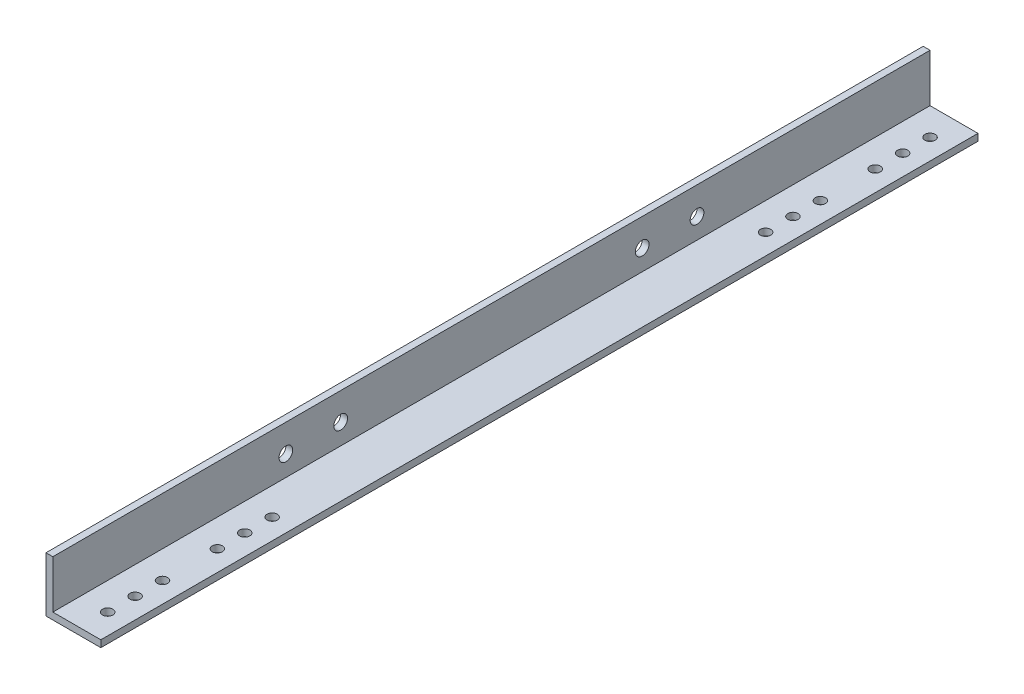
ISO-10303-21;
HEADER;
FILE_DESCRIPTION(('STEP AP214'),'2;1');
FILE_NAME('part.step','',(''),(''),'','','');
FILE_SCHEMA(('AUTOMOTIVE_DESIGN { 1 0 10303 214 1 1 1 1 }'));
ENDSEC;
DATA;
#1=APPLICATION_CONTEXT('core data for automotive mechanical design processes');
#2=APPLICATION_PROTOCOL_DEFINITION('international standard','automotive_design',2000,#1);
#3=PRODUCT_CONTEXT('',#1,'mechanical');
#4=PRODUCT('Part','Part','',(#3));
#5=PRODUCT_RELATED_PRODUCT_CATEGORY('part','',(#4));
#6=PRODUCT_DEFINITION_FORMATION('','',#4);
#7=PRODUCT_DEFINITION_CONTEXT('part definition',#1,'design');
#8=PRODUCT_DEFINITION('design','',#6,#7);
#9=PRODUCT_DEFINITION_SHAPE('','',#8);
#10=(LENGTH_UNIT() NAMED_UNIT(*) SI_UNIT(.MILLI.,.METRE.));
#11=(NAMED_UNIT(*) PLANE_ANGLE_UNIT() SI_UNIT($,.RADIAN.));
#12=(NAMED_UNIT(*) SI_UNIT($,.STERADIAN.) SOLID_ANGLE_UNIT());
#13=UNCERTAINTY_MEASURE_WITH_UNIT(LENGTH_MEASURE(1.E-05),#10,'distance_accuracy_value','');
#14=(GEOMETRIC_REPRESENTATION_CONTEXT(3) GLOBAL_UNCERTAINTY_ASSIGNED_CONTEXT((#13)) GLOBAL_UNIT_ASSIGNED_CONTEXT((#10,
#11,#12)) REPRESENTATION_CONTEXT('',''));
#15=CARTESIAN_POINT('',(0.,0.,0.));
#16=DIRECTION('',(0.,0.,1.));
#17=DIRECTION('',(1.,0.,0.));
#18=AXIS2_PLACEMENT_3D('',#15,#16,#17);
#19=CARTESIAN_POINT('',(0.,25.4,406.4));
#20=DIRECTION('',(1.,0.,0.));
#21=DIRECTION('',(0.,1.,0.));
#22=AXIS2_PLACEMENT_3D('',#19,#20,#21);
#23=PLANE('',#22);
#24=DIRECTION('',(0.,-1.,0.));
#25=VECTOR('',#24,1.);
#26=CARTESIAN_POINT('',(0.,25.4,0.));
#27=LINE('',#26,#25);
#28=CARTESIAN_POINT('',(0.,25.4,0.));
#29=VERTEX_POINT('',#28);
#30=CARTESIAN_POINT('',(0.,0.,0.));
#31=VERTEX_POINT('',#30);
#32=EDGE_CURVE('E123',#29,#31,#27,.T.);
#33=ORIENTED_EDGE('',*,*,#32,.T.);
#34=DIRECTION('',(0.,0.,-1.));
#35=VECTOR('',#34,1.);
#36=CARTESIAN_POINT('',(0.,0.,406.4));
#37=LINE('',#36,#35);
#38=CARTESIAN_POINT('',(0.,0.,406.4));
#39=VERTEX_POINT('',#38);
#40=EDGE_CURVE('E11',#39,#31,#37,.T.);
#41=ORIENTED_EDGE('',*,*,#40,.F.);
#42=DIRECTION('',(0.,-1.,0.));
#43=VECTOR('',#42,1.);
#44=CARTESIAN_POINT('',(0.,25.4,406.4));
#45=LINE('',#44,#43);
#46=CARTESIAN_POINT('',(0.,25.4,406.4));
#47=VERTEX_POINT('',#46);
#48=EDGE_CURVE('E134',#47,#39,#45,.T.);
#49=ORIENTED_EDGE('',*,*,#48,.F.);
#50=DIRECTION('',(0.,0.,-1.));
#51=VECTOR('',#50,1.);
#52=CARTESIAN_POINT('',(0.,25.4,406.4));
#53=LINE('',#52,#51);
#54=EDGE_CURVE('E119',#47,#29,#53,.T.);
#55=ORIENTED_EDGE('',*,*,#54,.T.);
#56=EDGE_LOOP('',(#33,#41,#49,#55));
#57=FACE_BOUND('',#56,.T.);
#58=CARTESIAN_POINT('',(0.,12.7,107.95));
#59=DIRECTION('',(-1.,0.,0.));
#60=DIRECTION('',(0.,0.,1.));
#61=AXIS2_PLACEMENT_3D('',#58,#59,#60);
#62=CIRCLE('',#61,3.175);
#63=CARTESIAN_POINT('',(0.,12.7,111.125));
#64=VERTEX_POINT('',#63);
#65=EDGE_CURVE('E144',#64,#64,#62,.T.);
#66=ORIENTED_EDGE('',*,*,#65,.F.);
#67=EDGE_LOOP('',(#66));
#68=FACE_BOUND('',#67,.T.);
#69=CARTESIAN_POINT('',(0.,12.7,273.05));
#70=DIRECTION('',(-1.,0.,0.));
#71=DIRECTION('',(0.,0.,1.));
#72=AXIS2_PLACEMENT_3D('',#69,#70,#71);
#73=CIRCLE('',#72,3.17500000000003);
#74=CARTESIAN_POINT('',(0.,12.7,276.225));
#75=VERTEX_POINT('',#74);
#76=EDGE_CURVE('E161',#75,#75,#73,.F.);
#77=ORIENTED_EDGE('',*,*,#76,.T.);
#78=EDGE_LOOP('',(#77));
#79=FACE_BOUND('',#78,.T.);
#80=CARTESIAN_POINT('',(0.,12.7,298.45));
#81=DIRECTION('',(-1.,0.,0.));
#82=DIRECTION('',(0.,0.,1.));
#83=AXIS2_PLACEMENT_3D('',#80,#81,#82);
#84=CIRCLE('',#83,3.17500000000002);
#85=CARTESIAN_POINT('',(0.,12.7,301.625));
#86=VERTEX_POINT('',#85);
#87=EDGE_CURVE('E454',#86,#86,#84,.F.);
#88=ORIENTED_EDGE('',*,*,#87,.T.);
#89=EDGE_LOOP('',(#88));
#90=FACE_BOUND('',#89,.T.);
#91=CARTESIAN_POINT('',(0.,12.7,133.35));
#92=DIRECTION('',(-1.,0.,0.));
#93=DIRECTION('',(0.,0.,1.));
#94=AXIS2_PLACEMENT_3D('',#91,#92,#93);
#95=CIRCLE('',#94,3.175);
#96=CARTESIAN_POINT('',(0.,12.7,136.525));
#97=VERTEX_POINT('',#96);
#98=EDGE_CURVE('E148',#97,#97,#95,.T.);
#99=ORIENTED_EDGE('',*,*,#98,.F.);
#100=EDGE_LOOP('',(#99));
#101=FACE_BOUND('',#100,.T.);
#102=ADVANCED_FACE('F35',(#57,#68,#79,#90,#101),#23,.F.);
#103=CARTESIAN_POINT('',(3.175,3.17499999999999,406.4));
#104=DIRECTION('',(-1.,0.,0.));
#105=DIRECTION('',(0.,-1.,0.));
#106=AXIS2_PLACEMENT_3D('',#103,#104,#105);
#107=PLANE('',#106);
#108=DIRECTION('',(0.,1.,0.));
#109=VECTOR('',#108,1.);
#110=CARTESIAN_POINT('',(3.175,3.17499999999999,0.));
#111=LINE('',#110,#109);
#112=CARTESIAN_POINT('',(3.175,3.17499999999999,0.));
#113=VERTEX_POINT('',#112);
#114=CARTESIAN_POINT('',(3.175,25.4,0.));
#115=VERTEX_POINT('',#114);
#116=EDGE_CURVE('E76',#113,#115,#111,.T.);
#117=ORIENTED_EDGE('',*,*,#116,.T.);
#118=DIRECTION('',(0.,0.,-1.));
#119=VECTOR('',#118,1.);
#120=CARTESIAN_POINT('',(3.175,25.4,406.4));
#121=LINE('',#120,#119);
#122=CARTESIAN_POINT('',(3.175,25.4,406.4));
#123=VERTEX_POINT('',#122);
#124=EDGE_CURVE('E114',#123,#115,#121,.T.);
#125=ORIENTED_EDGE('',*,*,#124,.F.);
#126=DIRECTION('',(0.,1.,0.));
#127=VECTOR('',#126,1.);
#128=CARTESIAN_POINT('',(3.175,3.17499999999999,406.4));
#129=LINE('',#128,#127);
#130=CARTESIAN_POINT('',(3.175,3.17499999999999,406.4));
#131=VERTEX_POINT('',#130);
#132=EDGE_CURVE('E101',#131,#123,#129,.T.);
#133=ORIENTED_EDGE('',*,*,#132,.F.);
#134=DIRECTION('',(0.,0.,-1.));
#135=VECTOR('',#134,1.);
#136=CARTESIAN_POINT('',(3.175,3.17499999999999,406.4));
#137=LINE('',#136,#135);
#138=EDGE_CURVE('E108',#131,#113,#137,.T.);
#139=ORIENTED_EDGE('',*,*,#138,.T.);
#140=EDGE_LOOP('',(#117,#125,#133,#139));
#141=FACE_BOUND('',#140,.T.);
#142=CARTESIAN_POINT('',(3.175,12.7,107.95));
#143=DIRECTION('',(-1.,0.,0.));
#144=DIRECTION('',(0.,-1.,0.));
#145=AXIS2_PLACEMENT_3D('',#142,#143,#144);
#146=CIRCLE('',#145,3.175);
#147=CARTESIAN_POINT('',(3.175,9.52500000000002,107.95));
#148=VERTEX_POINT('',#147);
#149=EDGE_CURVE('E140',#148,#148,#146,.T.);
#150=ORIENTED_EDGE('',*,*,#149,.T.);
#151=EDGE_LOOP('',(#150));
#152=FACE_BOUND('',#151,.T.);
#153=CARTESIAN_POINT('',(3.175,12.7,273.05));
#154=DIRECTION('',(-1.,0.,0.));
#155=DIRECTION('',(0.,-1.,0.));
#156=AXIS2_PLACEMENT_3D('',#153,#154,#155);
#157=CIRCLE('',#156,3.17500000000003);
#158=CARTESIAN_POINT('',(3.175,9.525,273.05));
#159=VERTEX_POINT('',#158);
#160=EDGE_CURVE('E145',#159,#159,#157,.F.);
#161=ORIENTED_EDGE('',*,*,#160,.F.);
#162=EDGE_LOOP('',(#161));
#163=FACE_BOUND('',#162,.T.);
#164=CARTESIAN_POINT('',(3.175,12.7,298.45));
#165=DIRECTION('',(-1.,0.,0.));
#166=DIRECTION('',(0.,-1.,0.));
#167=AXIS2_PLACEMENT_3D('',#164,#165,#166);
#168=CIRCLE('',#167,3.17500000000002);
#169=CARTESIAN_POINT('',(3.175,9.52500000000001,298.45));
#170=VERTEX_POINT('',#169);
#171=EDGE_CURVE('E147',#170,#170,#168,.F.);
#172=ORIENTED_EDGE('',*,*,#171,.F.);
#173=EDGE_LOOP('',(#172));
#174=FACE_BOUND('',#173,.T.);
#175=CARTESIAN_POINT('',(3.175,12.7,133.35));
#176=DIRECTION('',(-1.,0.,0.));
#177=DIRECTION('',(0.,-1.,0.));
#178=AXIS2_PLACEMENT_3D('',#175,#176,#177);
#179=CIRCLE('',#178,3.175);
#180=CARTESIAN_POINT('',(3.175,9.52500000000003,133.35));
#181=VERTEX_POINT('',#180);
#182=EDGE_CURVE('E38',#181,#181,#179,.T.);
#183=ORIENTED_EDGE('',*,*,#182,.T.);
#184=EDGE_LOOP('',(#183));
#185=FACE_BOUND('',#184,.T.);
#186=ADVANCED_FACE('F116',(#141,#152,#163,#174,#185),#107,.F.);
#187=CARTESIAN_POINT('',(0.,0.,406.4));
#188=DIRECTION('',(0.,1.,0.));
#189=DIRECTION('',(0.,0.,1.));
#190=AXIS2_PLACEMENT_3D('',#187,#188,#189);
#191=PLANE('',#190);
#192=CARTESIAN_POINT('',(15.875,0.,381.));
#193=DIRECTION('',(0.,1.,0.));
#194=DIRECTION('',(-1.,0.,0.));
#195=AXIS2_PLACEMENT_3D('',#192,#193,#194);
#196=CIRCLE('',#195,2.38125000000002);
#197=CARTESIAN_POINT('',(13.49375,0.,381.));
#198=VERTEX_POINT('',#197);
#199=EDGE_CURVE('E170',#198,#198,#196,.T.);
#200=ORIENTED_EDGE('',*,*,#199,.T.);
#201=EDGE_LOOP('',(#200));
#202=FACE_BOUND('',#201,.T.);
#203=CARTESIAN_POINT('',(15.875,0.,342.9));
#204=DIRECTION('',(0.,1.,0.));
#205=DIRECTION('',(-1.,0.,0.));
#206=AXIS2_PLACEMENT_3D('',#203,#204,#205);
#207=CIRCLE('',#206,2.38125000000002);
#208=CARTESIAN_POINT('',(13.49375,0.,342.9));
#209=VERTEX_POINT('',#208);
#210=EDGE_CURVE('E176',#209,#209,#207,.F.);
#211=ORIENTED_EDGE('',*,*,#210,.F.);
#212=EDGE_LOOP('',(#211));
#213=FACE_BOUND('',#212,.T.);
#214=CARTESIAN_POINT('',(15.875,0.,330.2));
#215=DIRECTION('',(0.,1.,0.));
#216=DIRECTION('',(-1.,0.,0.));
#217=AXIS2_PLACEMENT_3D('',#214,#215,#216);
#218=CIRCLE('',#217,2.38125000000002);
#219=CARTESIAN_POINT('',(13.49375,0.,330.2));
#220=VERTEX_POINT('',#219);
#221=EDGE_CURVE('E182',#220,#220,#218,.F.);
#222=ORIENTED_EDGE('',*,*,#221,.F.);
#223=EDGE_LOOP('',(#222));
#224=FACE_BOUND('',#223,.T.);
#225=CARTESIAN_POINT('',(15.875,0.,317.5));
#226=DIRECTION('',(0.,1.,0.));
#227=DIRECTION('',(-1.,0.,0.));
#228=AXIS2_PLACEMENT_3D('',#225,#226,#227);
#229=CIRCLE('',#228,2.38125000000003);
#230=CARTESIAN_POINT('',(13.49375,0.,317.5));
#231=VERTEX_POINT('',#230);
#232=EDGE_CURVE('E188',#231,#231,#229,.F.);
#233=ORIENTED_EDGE('',*,*,#232,.F.);
#234=EDGE_LOOP('',(#233));
#235=FACE_BOUND('',#234,.T.);
#236=CARTESIAN_POINT('',(15.875,0.,76.2));
#237=DIRECTION('',(0.,1.,0.));
#238=DIRECTION('',(-1.,0.,0.));
#239=AXIS2_PLACEMENT_3D('',#236,#237,#238);
#240=CIRCLE('',#239,2.38125);
#241=CARTESIAN_POINT('',(13.49375,0.,76.2));
#242=VERTEX_POINT('',#241);
#243=EDGE_CURVE('E200',#242,#242,#240,.T.);
#244=ORIENTED_EDGE('',*,*,#243,.T.);
#245=EDGE_LOOP('',(#244));
#246=FACE_BOUND('',#245,.T.);
#247=DIRECTION('',(1.,0.,0.));
#248=VECTOR('',#247,1.);
#249=CARTESIAN_POINT('',(0.,0.,0.));
#250=LINE('',#249,#248);
#251=CARTESIAN_POINT('',(25.4,0.,0.));
#252=VERTEX_POINT('',#251);
#253=EDGE_CURVE('E126',#31,#252,#250,.T.);
#254=ORIENTED_EDGE('',*,*,#253,.T.);
#255=DIRECTION('',(0.,0.,-1.));
#256=VECTOR('',#255,1.);
#257=CARTESIAN_POINT('',(25.4,0.,406.4));
#258=LINE('',#257,#256);
#259=CARTESIAN_POINT('',(25.4,0.,406.4));
#260=VERTEX_POINT('',#259);
#261=EDGE_CURVE('E44',#260,#252,#258,.T.);
#262=ORIENTED_EDGE('',*,*,#261,.F.);
#263=DIRECTION('',(1.,0.,0.));
#264=VECTOR('',#263,1.);
#265=CARTESIAN_POINT('',(0.,0.,406.4));
#266=LINE('',#265,#264);
#267=EDGE_CURVE('E90',#39,#260,#266,.T.);
#268=ORIENTED_EDGE('',*,*,#267,.F.);
#269=ORIENTED_EDGE('',*,*,#40,.T.);
#270=EDGE_LOOP('',(#254,#262,#268,#269));
#271=FACE_BOUND('',#270,.T.);
#272=CARTESIAN_POINT('',(15.875,0.,393.7));
#273=DIRECTION('',(0.,1.,0.));
#274=DIRECTION('',(-1.,0.,0.));
#275=AXIS2_PLACEMENT_3D('',#272,#273,#274);
#276=CIRCLE('',#275,2.38125000000003);
#277=CARTESIAN_POINT('',(13.49375,0.,393.7));
#278=VERTEX_POINT('',#277);
#279=EDGE_CURVE('E127',#278,#278,#276,.T.);
#280=ORIENTED_EDGE('',*,*,#279,.T.);
#281=EDGE_LOOP('',(#280));
#282=FACE_BOUND('',#281,.T.);
#283=CARTESIAN_POINT('',(15.875,0.,12.7));
#284=DIRECTION('',(0.,1.,0.));
#285=DIRECTION('',(-1.,0.,0.));
#286=AXIS2_PLACEMENT_3D('',#283,#284,#285);
#287=CIRCLE('',#286,2.38125000000001);
#288=CARTESIAN_POINT('',(13.49375,0.,12.7));
#289=VERTEX_POINT('',#288);
#290=EDGE_CURVE('E224',#289,#289,#287,.F.);
#291=ORIENTED_EDGE('',*,*,#290,.F.);
#292=EDGE_LOOP('',(#291));
#293=FACE_BOUND('',#292,.T.);
#294=CARTESIAN_POINT('',(15.875,0.,25.4));
#295=DIRECTION('',(0.,1.,0.));
#296=DIRECTION('',(-1.,0.,0.));
#297=AXIS2_PLACEMENT_3D('',#294,#295,#296);
#298=CIRCLE('',#297,2.38125000000001);
#299=CARTESIAN_POINT('',(13.49375,0.,25.4));
#300=VERTEX_POINT('',#299);
#301=EDGE_CURVE('E218',#300,#300,#298,.F.);
#302=ORIENTED_EDGE('',*,*,#301,.F.);
#303=EDGE_LOOP('',(#302));
#304=FACE_BOUND('',#303,.T.);
#305=CARTESIAN_POINT('',(15.875,0.,38.1));
#306=DIRECTION('',(0.,1.,0.));
#307=DIRECTION('',(-1.,0.,0.));
#308=AXIS2_PLACEMENT_3D('',#305,#306,#307);
#309=CIRCLE('',#308,2.38125000000001);
#310=CARTESIAN_POINT('',(13.49375,0.,38.1));
#311=VERTEX_POINT('',#310);
#312=EDGE_CURVE('E212',#311,#311,#309,.F.);
#313=ORIENTED_EDGE('',*,*,#312,.F.);
#314=EDGE_LOOP('',(#313));
#315=FACE_BOUND('',#314,.T.);
#316=CARTESIAN_POINT('',(15.875,0.,63.5000000000001));
#317=DIRECTION('',(0.,1.,0.));
#318=DIRECTION('',(-1.,0.,0.));
#319=AXIS2_PLACEMENT_3D('',#316,#317,#318);
#320=CIRCLE('',#319,2.38125);
#321=CARTESIAN_POINT('',(13.49375,0.,63.5000000000001));
#322=VERTEX_POINT('',#321);
#323=EDGE_CURVE('E206',#322,#322,#320,.T.);
#324=ORIENTED_EDGE('',*,*,#323,.T.);
#325=EDGE_LOOP('',(#324));
#326=FACE_BOUND('',#325,.T.);
#327=CARTESIAN_POINT('',(15.875,0.,88.9));
#328=DIRECTION('',(0.,1.,0.));
#329=DIRECTION('',(-1.,0.,0.));
#330=AXIS2_PLACEMENT_3D('',#327,#328,#329);
#331=CIRCLE('',#330,2.38125000000001);
#332=CARTESIAN_POINT('',(13.49375,0.,88.9));
#333=VERTEX_POINT('',#332);
#334=EDGE_CURVE('E194',#333,#333,#331,.T.);
#335=ORIENTED_EDGE('',*,*,#334,.T.);
#336=EDGE_LOOP('',(#335));
#337=FACE_BOUND('',#336,.T.);
#338=CARTESIAN_POINT('',(15.875,0.,368.3));
#339=DIRECTION('',(0.,1.,0.));
#340=DIRECTION('',(-1.,0.,0.));
#341=AXIS2_PLACEMENT_3D('',#338,#339,#340);
#342=CIRCLE('',#341,2.38125000000002);
#343=CARTESIAN_POINT('',(13.49375,0.,368.3));
#344=VERTEX_POINT('',#343);
#345=EDGE_CURVE('E163',#344,#344,#342,.T.);
#346=ORIENTED_EDGE('',*,*,#345,.T.);
#347=EDGE_LOOP('',(#346));
#348=FACE_BOUND('',#347,.T.);
#349=ADVANCED_FACE('F236',(#202,#213,#224,#235,#246,#271,#282,#293,#304,#315,#326,#337,#348),
#191,.F.);
#350=CARTESIAN_POINT('',(25.4,3.175,406.4));
#351=DIRECTION('',(0.,-1.,0.));
#352=DIRECTION('',(1.,0.,0.));
#353=AXIS2_PLACEMENT_3D('',#350,#351,#352);
#354=PLANE('',#353);
#355=CARTESIAN_POINT('',(15.875,3.17499999999999,381.));
#356=DIRECTION('',(0.,1.,0.));
#357=DIRECTION('',(-1.,0.,0.));
#358=AXIS2_PLACEMENT_3D('',#355,#356,#357);
#359=CIRCLE('',#358,2.38125000000002);
#360=CARTESIAN_POINT('',(13.49375,3.17499999999999,381.));
#361=VERTEX_POINT('',#360);
#362=EDGE_CURVE('E173',#361,#361,#359,.T.);
#363=ORIENTED_EDGE('',*,*,#362,.F.);
#364=EDGE_LOOP('',(#363));
#365=FACE_BOUND('',#364,.T.);
#366=CARTESIAN_POINT('',(15.875,3.17499999999999,342.9));
#367=DIRECTION('',(0.,1.,0.));
#368=DIRECTION('',(-1.,0.,0.));
#369=AXIS2_PLACEMENT_3D('',#366,#367,#368);
#370=CIRCLE('',#369,2.38125000000002);
#371=CARTESIAN_POINT('',(13.49375,3.17499999999999,342.9));
#372=VERTEX_POINT('',#371);
#373=EDGE_CURVE('E179',#372,#372,#370,.F.);
#374=ORIENTED_EDGE('',*,*,#373,.T.);
#375=EDGE_LOOP('',(#374));
#376=FACE_BOUND('',#375,.T.);
#377=CARTESIAN_POINT('',(15.875,3.17499999999999,330.2));
#378=DIRECTION('',(0.,1.,0.));
#379=DIRECTION('',(-1.,0.,0.));
#380=AXIS2_PLACEMENT_3D('',#377,#378,#379);
#381=CIRCLE('',#380,2.38125000000002);
#382=CARTESIAN_POINT('',(13.49375,3.17499999999999,330.2));
#383=VERTEX_POINT('',#382);
#384=EDGE_CURVE('E185',#383,#383,#381,.F.);
#385=ORIENTED_EDGE('',*,*,#384,.T.);
#386=EDGE_LOOP('',(#385));
#387=FACE_BOUND('',#386,.T.);
#388=CARTESIAN_POINT('',(15.875,3.17499999999999,317.5));
#389=DIRECTION('',(0.,1.,0.));
#390=DIRECTION('',(-1.,0.,0.));
#391=AXIS2_PLACEMENT_3D('',#388,#389,#390);
#392=CIRCLE('',#391,2.38125000000003);
#393=CARTESIAN_POINT('',(13.49375,3.17499999999999,317.5));
#394=VERTEX_POINT('',#393);
#395=EDGE_CURVE('E191',#394,#394,#392,.F.);
#396=ORIENTED_EDGE('',*,*,#395,.T.);
#397=EDGE_LOOP('',(#396));
#398=FACE_BOUND('',#397,.T.);
#399=CARTESIAN_POINT('',(15.875,3.17499999999999,76.2));
#400=DIRECTION('',(0.,1.,0.));
#401=DIRECTION('',(-1.,0.,0.));
#402=AXIS2_PLACEMENT_3D('',#399,#400,#401);
#403=CIRCLE('',#402,2.38125);
#404=CARTESIAN_POINT('',(13.49375,3.17499999999999,76.2));
#405=VERTEX_POINT('',#404);
#406=EDGE_CURVE('E203',#405,#405,#403,.T.);
#407=ORIENTED_EDGE('',*,*,#406,.F.);
#408=EDGE_LOOP('',(#407));
#409=FACE_BOUND('',#408,.T.);
#410=DIRECTION('',(-1.,0.,0.));
#411=VECTOR('',#410,1.);
#412=CARTESIAN_POINT('',(25.4,3.175,0.));
#413=LINE('',#412,#411);
#414=CARTESIAN_POINT('',(25.4,3.175,0.));
#415=VERTEX_POINT('',#414);
#416=EDGE_CURVE('E112',#415,#113,#413,.T.);
#417=ORIENTED_EDGE('',*,*,#416,.T.);
#418=ORIENTED_EDGE('',*,*,#138,.F.);
#419=DIRECTION('',(-1.,0.,0.));
#420=VECTOR('',#419,1.);
#421=CARTESIAN_POINT('',(25.4,3.175,406.4));
#422=LINE('',#421,#420);
#423=CARTESIAN_POINT('',(25.4,3.175,406.4));
#424=VERTEX_POINT('',#423);
#425=EDGE_CURVE('E97',#424,#131,#422,.T.);
#426=ORIENTED_EDGE('',*,*,#425,.F.);
#427=DIRECTION('',(0.,0.,-1.));
#428=VECTOR('',#427,1.);
#429=CARTESIAN_POINT('',(25.4,3.175,406.4));
#430=LINE('',#429,#428);
#431=EDGE_CURVE('E113',#424,#415,#430,.T.);
#432=ORIENTED_EDGE('',*,*,#431,.T.);
#433=EDGE_LOOP('',(#417,#418,#426,#432));
#434=FACE_BOUND('',#433,.T.);
#435=CARTESIAN_POINT('',(15.875,3.17499999999999,393.7));
#436=DIRECTION('',(0.,1.,0.));
#437=DIRECTION('',(-1.,0.,0.));
#438=AXIS2_PLACEMENT_3D('',#435,#436,#437);
#439=CIRCLE('',#438,2.38125000000003);
#440=CARTESIAN_POINT('',(13.49375,3.17499999999999,393.7));
#441=VERTEX_POINT('',#440);
#442=EDGE_CURVE('E166',#441,#441,#439,.T.);
#443=ORIENTED_EDGE('',*,*,#442,.F.);
#444=EDGE_LOOP('',(#443));
#445=FACE_BOUND('',#444,.T.);
#446=CARTESIAN_POINT('',(15.875,3.17499999999999,12.7));
#447=DIRECTION('',(0.,1.,0.));
#448=DIRECTION('',(-1.,0.,0.));
#449=AXIS2_PLACEMENT_3D('',#446,#447,#448);
#450=CIRCLE('',#449,2.38125000000001);
#451=CARTESIAN_POINT('',(13.49375,3.17499999999999,12.7));
#452=VERTEX_POINT('',#451);
#453=EDGE_CURVE('E143',#452,#452,#450,.F.);
#454=ORIENTED_EDGE('',*,*,#453,.T.);
#455=EDGE_LOOP('',(#454));
#456=FACE_BOUND('',#455,.T.);
#457=CARTESIAN_POINT('',(15.875,3.17499999999999,25.4));
#458=DIRECTION('',(0.,1.,0.));
#459=DIRECTION('',(-1.,0.,0.));
#460=AXIS2_PLACEMENT_3D('',#457,#458,#459);
#461=CIRCLE('',#460,2.38125000000001);
#462=CARTESIAN_POINT('',(13.49375,3.17499999999999,25.4));
#463=VERTEX_POINT('',#462);
#464=EDGE_CURVE('E221',#463,#463,#461,.F.);
#465=ORIENTED_EDGE('',*,*,#464,.T.);
#466=EDGE_LOOP('',(#465));
#467=FACE_BOUND('',#466,.T.);
#468=CARTESIAN_POINT('',(15.875,3.17499999999999,38.1));
#469=DIRECTION('',(0.,1.,0.));
#470=DIRECTION('',(-1.,0.,0.));
#471=AXIS2_PLACEMENT_3D('',#468,#469,#470);
#472=CIRCLE('',#471,2.38125000000001);
#473=CARTESIAN_POINT('',(13.49375,3.17499999999999,38.1));
#474=VERTEX_POINT('',#473);
#475=EDGE_CURVE('E215',#474,#474,#472,.F.);
#476=ORIENTED_EDGE('',*,*,#475,.T.);
#477=EDGE_LOOP('',(#476));
#478=FACE_BOUND('',#477,.T.);
#479=CARTESIAN_POINT('',(15.875,3.17499999999999,63.5000000000001));
#480=DIRECTION('',(0.,1.,0.));
#481=DIRECTION('',(-1.,0.,0.));
#482=AXIS2_PLACEMENT_3D('',#479,#480,#481);
#483=CIRCLE('',#482,2.38125);
#484=CARTESIAN_POINT('',(13.49375,3.17499999999999,63.5000000000001));
#485=VERTEX_POINT('',#484);
#486=EDGE_CURVE('E209',#485,#485,#483,.T.);
#487=ORIENTED_EDGE('',*,*,#486,.F.);
#488=EDGE_LOOP('',(#487));
#489=FACE_BOUND('',#488,.T.);
#490=CARTESIAN_POINT('',(15.875,3.17499999999999,88.9));
#491=DIRECTION('',(0.,1.,0.));
#492=DIRECTION('',(-1.,0.,0.));
#493=AXIS2_PLACEMENT_3D('',#490,#491,#492);
#494=CIRCLE('',#493,2.38125000000001);
#495=CARTESIAN_POINT('',(13.49375,3.17499999999999,88.9));
#496=VERTEX_POINT('',#495);
#497=EDGE_CURVE('E197',#496,#496,#494,.T.);
#498=ORIENTED_EDGE('',*,*,#497,.F.);
#499=EDGE_LOOP('',(#498));
#500=FACE_BOUND('',#499,.T.);
#501=CARTESIAN_POINT('',(15.875,3.17499999999999,368.3));
#502=DIRECTION('',(0.,1.,0.));
#503=DIRECTION('',(-1.,0.,0.));
#504=AXIS2_PLACEMENT_3D('',#501,#502,#503);
#505=CIRCLE('',#504,2.38125000000002);
#506=CARTESIAN_POINT('',(13.49375,3.17499999999999,368.3));
#507=VERTEX_POINT('',#506);
#508=EDGE_CURVE('E167',#507,#507,#505,.T.);
#509=ORIENTED_EDGE('',*,*,#508,.F.);
#510=EDGE_LOOP('',(#509));
#511=FACE_BOUND('',#510,.T.);
#512=ADVANCED_FACE('F109',(#365,#376,#387,#398,#409,#434,#445,#456,#467,#478,#489,#500,#511),
#354,.F.);
#513=CARTESIAN_POINT('',(25.4,0.,406.4));
#514=DIRECTION('',(-1.,0.,0.));
#515=DIRECTION('',(0.,0.,1.));
#516=AXIS2_PLACEMENT_3D('',#513,#514,#515);
#517=PLANE('',#516);
#518=DIRECTION('',(0.,1.,0.));
#519=VECTOR('',#518,1.);
#520=CARTESIAN_POINT('',(25.4,0.,0.));
#521=LINE('',#520,#519);
#522=EDGE_CURVE('E129',#252,#415,#521,.T.);
#523=ORIENTED_EDGE('',*,*,#522,.T.);
#524=ORIENTED_EDGE('',*,*,#431,.F.);
#525=DIRECTION('',(0.,1.,0.));
#526=VECTOR('',#525,1.);
#527=CARTESIAN_POINT('',(25.4,0.,406.4));
#528=LINE('',#527,#526);
#529=EDGE_CURVE('E103',#260,#424,#528,.T.);
#530=ORIENTED_EDGE('',*,*,#529,.F.);
#531=ORIENTED_EDGE('',*,*,#261,.T.);
#532=EDGE_LOOP('',(#523,#524,#530,#531));
#533=FACE_BOUND('',#532,.T.);
#534=ADVANCED_FACE('F240',(#533),#517,.F.);
#535=CARTESIAN_POINT('',(3.175,25.4,406.4));
#536=DIRECTION('',(0.,-1.,0.));
#537=DIRECTION('',(0.,0.,-1.));
#538=AXIS2_PLACEMENT_3D('',#535,#536,#537);
#539=PLANE('',#538);
#540=DIRECTION('',(-1.,0.,0.));
#541=VECTOR('',#540,1.);
#542=CARTESIAN_POINT('',(3.175,25.4,0.));
#543=LINE('',#542,#541);
#544=EDGE_CURVE('E82',#115,#29,#543,.T.);
#545=ORIENTED_EDGE('',*,*,#544,.T.);
#546=ORIENTED_EDGE('',*,*,#54,.F.);
#547=DIRECTION('',(-1.,0.,0.));
#548=VECTOR('',#547,1.);
#549=CARTESIAN_POINT('',(3.175,25.4,406.4));
#550=LINE('',#549,#548);
#551=EDGE_CURVE('E53',#123,#47,#550,.T.);
#552=ORIENTED_EDGE('',*,*,#551,.F.);
#553=ORIENTED_EDGE('',*,*,#124,.T.);
#554=EDGE_LOOP('',(#545,#546,#552,#553));
#555=FACE_BOUND('',#554,.T.);
#556=ADVANCED_FACE('F246',(#555),#539,.F.);
#557=CARTESIAN_POINT('',(0.,0.,406.4));
#558=DIRECTION('',(0.,0.,1.));
#559=DIRECTION('',(1.,0.,0.));
#560=AXIS2_PLACEMENT_3D('',#557,#558,#559);
#561=PLANE('',#560);
#562=ORIENTED_EDGE('',*,*,#48,.T.);
#563=ORIENTED_EDGE('',*,*,#267,.T.);
#564=ORIENTED_EDGE('',*,*,#529,.T.);
#565=ORIENTED_EDGE('',*,*,#425,.T.);
#566=ORIENTED_EDGE('',*,*,#132,.T.);
#567=ORIENTED_EDGE('',*,*,#551,.T.);
#568=EDGE_LOOP('',(#562,#563,#564,#565,#566,#567));
#569=FACE_BOUND('',#568,.T.);
#570=ADVANCED_FACE('F99',(#569),#561,.T.);
#571=CARTESIAN_POINT('',(0.,0.,0.));
#572=DIRECTION('',(0.,0.,1.));
#573=DIRECTION('',(1.,0.,0.));
#574=AXIS2_PLACEMENT_3D('',#571,#572,#573);
#575=PLANE('',#574);
#576=ORIENTED_EDGE('',*,*,#32,.F.);
#577=ORIENTED_EDGE('',*,*,#544,.F.);
#578=ORIENTED_EDGE('',*,*,#116,.F.);
#579=ORIENTED_EDGE('',*,*,#416,.F.);
#580=ORIENTED_EDGE('',*,*,#522,.F.);
#581=ORIENTED_EDGE('',*,*,#253,.F.);
#582=EDGE_LOOP('',(#576,#577,#578,#579,#580,#581));
#583=FACE_BOUND('',#582,.T.);
#584=ADVANCED_FACE('F243',(#583),#575,.F.);
#585=CARTESIAN_POINT('',(15.875,0.,393.7));
#586=DIRECTION('',(0.,1.,0.));
#587=DIRECTION('',(-1.,0.,0.));
#588=AXIS2_PLACEMENT_3D('',#585,#586,#587);
#589=CYLINDRICAL_SURFACE('',#588,2.38125000000003);
#590=ORIENTED_EDGE('',*,*,#279,.F.);
#591=EDGE_LOOP('',(#590));
#592=FACE_BOUND('',#591,.T.);
#593=ORIENTED_EDGE('',*,*,#442,.T.);
#594=EDGE_LOOP('',(#593));
#595=FACE_BOUND('',#594,.T.);
#596=ADVANCED_FACE('F309',(#592,#595),#589,.F.);
#597=CARTESIAN_POINT('',(15.875,0.,12.7));
#598=DIRECTION('',(0.,1.,0.));
#599=DIRECTION('',(-1.,0.,0.));
#600=AXIS2_PLACEMENT_3D('',#597,#598,#599);
#601=CYLINDRICAL_SURFACE('',#600,2.38125000000001);
#602=ORIENTED_EDGE('',*,*,#290,.T.);
#603=EDGE_LOOP('',(#602));
#604=FACE_BOUND('',#603,.T.);
#605=ORIENTED_EDGE('',*,*,#453,.F.);
#606=EDGE_LOOP('',(#605));
#607=FACE_BOUND('',#606,.T.);
#608=ADVANCED_FACE('F305',(#604,#607),#601,.F.);
#609=CARTESIAN_POINT('',(15.875,0.,25.4));
#610=DIRECTION('',(0.,1.,0.));
#611=DIRECTION('',(-1.,0.,0.));
#612=AXIS2_PLACEMENT_3D('',#609,#610,#611);
#613=CYLINDRICAL_SURFACE('',#612,2.38125000000001);
#614=ORIENTED_EDGE('',*,*,#301,.T.);
#615=EDGE_LOOP('',(#614));
#616=FACE_BOUND('',#615,.T.);
#617=ORIENTED_EDGE('',*,*,#464,.F.);
#618=EDGE_LOOP('',(#617));
#619=FACE_BOUND('',#618,.T.);
#620=ADVANCED_FACE('F301',(#616,#619),#613,.F.);
#621=CARTESIAN_POINT('',(15.875,0.,38.1));
#622=DIRECTION('',(0.,1.,0.));
#623=DIRECTION('',(-1.,0.,0.));
#624=AXIS2_PLACEMENT_3D('',#621,#622,#623);
#625=CYLINDRICAL_SURFACE('',#624,2.38125000000001);
#626=ORIENTED_EDGE('',*,*,#312,.T.);
#627=EDGE_LOOP('',(#626));
#628=FACE_BOUND('',#627,.T.);
#629=ORIENTED_EDGE('',*,*,#475,.F.);
#630=EDGE_LOOP('',(#629));
#631=FACE_BOUND('',#630,.T.);
#632=ADVANCED_FACE('F293',(#628,#631),#625,.F.);
#633=CARTESIAN_POINT('',(15.875,0.,63.5000000000001));
#634=DIRECTION('',(0.,1.,0.));
#635=DIRECTION('',(-1.,0.,0.));
#636=AXIS2_PLACEMENT_3D('',#633,#634,#635);
#637=CYLINDRICAL_SURFACE('',#636,2.38125);
#638=ORIENTED_EDGE('',*,*,#323,.F.);
#639=EDGE_LOOP('',(#638));
#640=FACE_BOUND('',#639,.T.);
#641=ORIENTED_EDGE('',*,*,#486,.T.);
#642=EDGE_LOOP('',(#641));
#643=FACE_BOUND('',#642,.T.);
#644=ADVANCED_FACE('F283',(#640,#643),#637,.F.);
#645=CARTESIAN_POINT('',(15.875,0.,76.2));
#646=DIRECTION('',(0.,1.,0.));
#647=DIRECTION('',(-1.,0.,0.));
#648=AXIS2_PLACEMENT_3D('',#645,#646,#647);
#649=CYLINDRICAL_SURFACE('',#648,2.38125);
#650=ORIENTED_EDGE('',*,*,#243,.F.);
#651=EDGE_LOOP('',(#650));
#652=FACE_BOUND('',#651,.T.);
#653=ORIENTED_EDGE('',*,*,#406,.T.);
#654=EDGE_LOOP('',(#653));
#655=FACE_BOUND('',#654,.T.);
#656=ADVANCED_FACE('F280',(#652,#655),#649,.F.);
#657=CARTESIAN_POINT('',(15.875,0.,88.9));
#658=DIRECTION('',(0.,1.,0.));
#659=DIRECTION('',(-1.,0.,0.));
#660=AXIS2_PLACEMENT_3D('',#657,#658,#659);
#661=CYLINDRICAL_SURFACE('',#660,2.38125000000001);
#662=ORIENTED_EDGE('',*,*,#334,.F.);
#663=EDGE_LOOP('',(#662));
#664=FACE_BOUND('',#663,.T.);
#665=ORIENTED_EDGE('',*,*,#497,.T.);
#666=EDGE_LOOP('',(#665));
#667=FACE_BOUND('',#666,.T.);
#668=ADVANCED_FACE('F282',(#664,#667),#661,.F.);
#669=CARTESIAN_POINT('',(15.875,0.,317.5));
#670=DIRECTION('',(0.,1.,0.));
#671=DIRECTION('',(-1.,0.,0.));
#672=AXIS2_PLACEMENT_3D('',#669,#670,#671);
#673=CYLINDRICAL_SURFACE('',#672,2.38125000000003);
#674=ORIENTED_EDGE('',*,*,#232,.T.);
#675=EDGE_LOOP('',(#674));
#676=FACE_BOUND('',#675,.T.);
#677=ORIENTED_EDGE('',*,*,#395,.F.);
#678=EDGE_LOOP('',(#677));
#679=FACE_BOUND('',#678,.T.);
#680=ADVANCED_FACE('F290',(#676,#679),#673,.F.);
#681=CARTESIAN_POINT('',(15.875,0.,330.2));
#682=DIRECTION('',(0.,1.,0.));
#683=DIRECTION('',(-1.,0.,0.));
#684=AXIS2_PLACEMENT_3D('',#681,#682,#683);
#685=CYLINDRICAL_SURFACE('',#684,2.38125000000002);
#686=ORIENTED_EDGE('',*,*,#221,.T.);
#687=EDGE_LOOP('',(#686));
#688=FACE_BOUND('',#687,.T.);
#689=ORIENTED_EDGE('',*,*,#384,.F.);
#690=EDGE_LOOP('',(#689));
#691=FACE_BOUND('',#690,.T.);
#692=ADVANCED_FACE('F358',(#688,#691),#685,.F.);
#693=CARTESIAN_POINT('',(15.875,0.,342.9));
#694=DIRECTION('',(0.,1.,0.));
#695=DIRECTION('',(-1.,0.,0.));
#696=AXIS2_PLACEMENT_3D('',#693,#694,#695);
#697=CYLINDRICAL_SURFACE('',#696,2.38125000000002);
#698=ORIENTED_EDGE('',*,*,#210,.T.);
#699=EDGE_LOOP('',(#698));
#700=FACE_BOUND('',#699,.T.);
#701=ORIENTED_EDGE('',*,*,#373,.F.);
#702=EDGE_LOOP('',(#701));
#703=FACE_BOUND('',#702,.T.);
#704=ADVANCED_FACE('F367',(#700,#703),#697,.F.);
#705=CARTESIAN_POINT('',(15.875,0.,381.));
#706=DIRECTION('',(0.,1.,0.));
#707=DIRECTION('',(-1.,0.,0.));
#708=AXIS2_PLACEMENT_3D('',#705,#706,#707);
#709=CYLINDRICAL_SURFACE('',#708,2.38125000000002);
#710=ORIENTED_EDGE('',*,*,#199,.F.);
#711=EDGE_LOOP('',(#710));
#712=FACE_BOUND('',#711,.T.);
#713=ORIENTED_EDGE('',*,*,#362,.T.);
#714=EDGE_LOOP('',(#713));
#715=FACE_BOUND('',#714,.T.);
#716=ADVANCED_FACE('F377',(#712,#715),#709,.F.);
#717=CARTESIAN_POINT('',(15.875,0.,368.3));
#718=DIRECTION('',(0.,1.,0.));
#719=DIRECTION('',(-1.,0.,0.));
#720=AXIS2_PLACEMENT_3D('',#717,#718,#719);
#721=CYLINDRICAL_SURFACE('',#720,2.38125000000002);
#722=ORIENTED_EDGE('',*,*,#345,.F.);
#723=EDGE_LOOP('',(#722));
#724=FACE_BOUND('',#723,.T.);
#725=ORIENTED_EDGE('',*,*,#508,.T.);
#726=EDGE_LOOP('',(#725));
#727=FACE_BOUND('',#726,.T.);
#728=ADVANCED_FACE('F387',(#724,#727),#721,.F.);
#729=CARTESIAN_POINT('',(25.4,12.7,107.95));
#730=DIRECTION('',(-1.,0.,0.));
#731=DIRECTION('',(0.,0.,1.));
#732=AXIS2_PLACEMENT_3D('',#729,#730,#731);
#733=CYLINDRICAL_SURFACE('',#732,3.175);
#734=ORIENTED_EDGE('',*,*,#65,.T.);
#735=EDGE_LOOP('',(#734));
#736=FACE_BOUND('',#735,.T.);
#737=ORIENTED_EDGE('',*,*,#149,.F.);
#738=EDGE_LOOP('',(#737));
#739=FACE_BOUND('',#738,.T.);
#740=ADVANCED_FACE('F396',(#736,#739),#733,.F.);
#741=CARTESIAN_POINT('',(25.4,12.7,273.05));
#742=DIRECTION('',(-1.,0.,0.));
#743=DIRECTION('',(0.,0.,1.));
#744=AXIS2_PLACEMENT_3D('',#741,#742,#743);
#745=CYLINDRICAL_SURFACE('',#744,3.17500000000003);
#746=ORIENTED_EDGE('',*,*,#76,.F.);
#747=EDGE_LOOP('',(#746));
#748=FACE_BOUND('',#747,.T.);
#749=ORIENTED_EDGE('',*,*,#160,.T.);
#750=EDGE_LOOP('',(#749));
#751=FACE_BOUND('',#750,.T.);
#752=ADVANCED_FACE('F415',(#748,#751),#745,.F.);
#753=CARTESIAN_POINT('',(25.4,12.7,298.45));
#754=DIRECTION('',(-1.,0.,0.));
#755=DIRECTION('',(0.,0.,1.));
#756=AXIS2_PLACEMENT_3D('',#753,#754,#755);
#757=CYLINDRICAL_SURFACE('',#756,3.17500000000002);
#758=ORIENTED_EDGE('',*,*,#87,.F.);
#759=EDGE_LOOP('',(#758));
#760=FACE_BOUND('',#759,.T.);
#761=ORIENTED_EDGE('',*,*,#171,.T.);
#762=EDGE_LOOP('',(#761));
#763=FACE_BOUND('',#762,.T.);
#764=ADVANCED_FACE('F425',(#760,#763),#757,.F.);
#765=CARTESIAN_POINT('',(25.4,12.7,133.35));
#766=DIRECTION('',(-1.,0.,0.));
#767=DIRECTION('',(0.,0.,1.));
#768=AXIS2_PLACEMENT_3D('',#765,#766,#767);
#769=CYLINDRICAL_SURFACE('',#768,3.175);
#770=ORIENTED_EDGE('',*,*,#98,.T.);
#771=EDGE_LOOP('',(#770));
#772=FACE_BOUND('',#771,.T.);
#773=ORIENTED_EDGE('',*,*,#182,.F.);
#774=EDGE_LOOP('',(#773));
#775=FACE_BOUND('',#774,.T.);
#776=ADVANCED_FACE('F436',(#772,#775),#769,.F.);
#777=CLOSED_SHELL('',(#102,#186,#349,#512,#534,#556,#570,#584,#596,#608,#620,#632,#644,#656,
#668,#680,#692,#704,#716,#728,#740,#752,#764,#776));
#778=MANIFOLD_SOLID_BREP('B2',#777);
#779=ADVANCED_BREP_SHAPE_REPRESENTATION('',(#18,#778),#14);
#780=SHAPE_DEFINITION_REPRESENTATION(#9,#779);
ENDSEC;
END-ISO-10303-21;
